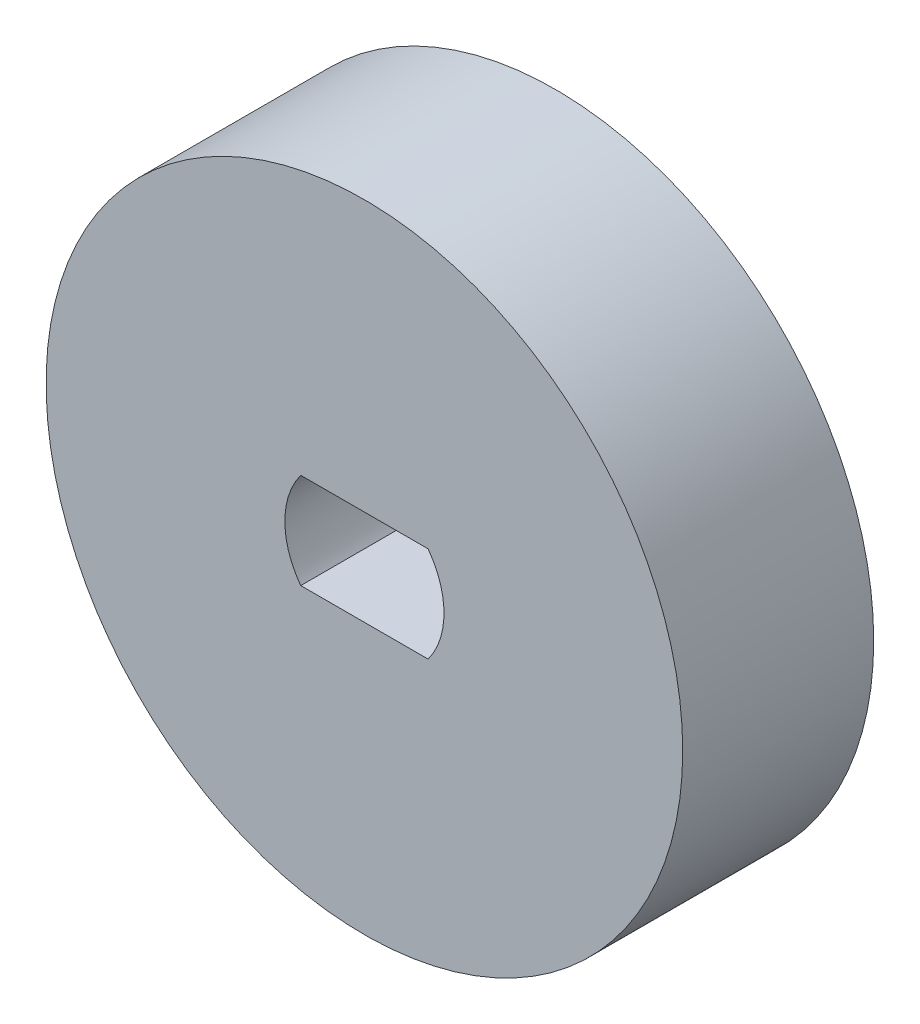
ISO-10303-21;
HEADER;
FILE_DESCRIPTION(('STEP AP214'),'2;1');
FILE_NAME('part.step','',(''),(''),'','','');
FILE_SCHEMA(('AUTOMOTIVE_DESIGN { 1 0 10303 214 1 1 1 1 }'));
ENDSEC;
DATA;
#1=APPLICATION_CONTEXT('core data for automotive mechanical design processes');
#2=APPLICATION_PROTOCOL_DEFINITION('international standard','automotive_design',2000,#1);
#3=PRODUCT_CONTEXT('',#1,'mechanical');
#4=PRODUCT('Part','Part','',(#3));
#5=PRODUCT_RELATED_PRODUCT_CATEGORY('part','',(#4));
#6=PRODUCT_DEFINITION_FORMATION('','',#4);
#7=PRODUCT_DEFINITION_CONTEXT('part definition',#1,'design');
#8=PRODUCT_DEFINITION('design','',#6,#7);
#9=PRODUCT_DEFINITION_SHAPE('','',#8);
#10=(LENGTH_UNIT() NAMED_UNIT(*) SI_UNIT(.MILLI.,.METRE.));
#11=(NAMED_UNIT(*) PLANE_ANGLE_UNIT() SI_UNIT($,.RADIAN.));
#12=(NAMED_UNIT(*) SI_UNIT($,.STERADIAN.) SOLID_ANGLE_UNIT());
#13=UNCERTAINTY_MEASURE_WITH_UNIT(LENGTH_MEASURE(1.E-05),#10,'distance_accuracy_value','');
#14=(GEOMETRIC_REPRESENTATION_CONTEXT(3) GLOBAL_UNCERTAINTY_ASSIGNED_CONTEXT((#13)) GLOBAL_UNIT_ASSIGNED_CONTEXT((#10,
#11,#12)) REPRESENTATION_CONTEXT('',''));
#15=CARTESIAN_POINT('',(0.,0.,0.));
#16=DIRECTION('',(0.,0.,1.));
#17=DIRECTION('',(1.,0.,0.));
#18=AXIS2_PLACEMENT_3D('',#15,#16,#17);
#19=CARTESIAN_POINT('',(8.50623475222368,0.,6.));
#20=DIRECTION('',(0.,0.,-1.));
#21=DIRECTION('',(-1.,0.,0.));
#22=AXIS2_PLACEMENT_3D('',#19,#20,#21);
#23=CYLINDRICAL_SURFACE('',#22,2.5);
#24=CARTESIAN_POINT('',(8.50623475222368,0.,0.));
#25=DIRECTION('',(0.,0.,1.));
#26=DIRECTION('',(1.,0.,0.));
#27=AXIS2_PLACEMENT_3D('',#24,#25,#26);
#28=CIRCLE('',#27,2.5);
#29=CARTESIAN_POINT('',(10.5062347522237,-1.5,0.));
#30=VERTEX_POINT('',#29);
#31=CARTESIAN_POINT('',(10.5062347522237,1.5,0.));
#32=VERTEX_POINT('',#31);
#33=EDGE_CURVE('E112',#30,#32,#28,.T.);
#34=ORIENTED_EDGE('',*,*,#33,.F.);
#35=DIRECTION('',(0.,0.,-1.));
#36=VECTOR('',#35,1.);
#37=CARTESIAN_POINT('',(10.5062347522237,-1.5,6.));
#38=LINE('',#37,#36);
#39=CARTESIAN_POINT('',(10.5062347522237,-1.5,6.));
#40=VERTEX_POINT('',#39);
#41=EDGE_CURVE('E11',#40,#30,#38,.T.);
#42=ORIENTED_EDGE('',*,*,#41,.F.);
#43=CARTESIAN_POINT('',(8.50623475222368,0.,6.));
#44=DIRECTION('',(0.,0.,1.));
#45=DIRECTION('',(1.,0.,0.));
#46=AXIS2_PLACEMENT_3D('',#43,#44,#45);
#47=CIRCLE('',#46,2.5);
#48=CARTESIAN_POINT('',(10.5062347522237,1.5,6.));
#49=VERTEX_POINT('',#48);
#50=EDGE_CURVE('E83',#40,#49,#47,.T.);
#51=ORIENTED_EDGE('',*,*,#50,.T.);
#52=DIRECTION('',(0.,0.,-1.));
#53=VECTOR('',#52,1.);
#54=CARTESIAN_POINT('',(10.5062347522237,1.5,6.));
#55=LINE('',#54,#53);
#56=EDGE_CURVE('E50',#49,#32,#55,.T.);
#57=ORIENTED_EDGE('',*,*,#56,.T.);
#58=EDGE_LOOP('',(#34,#42,#51,#57));
#59=FACE_BOUND('',#58,.T.);
#60=ADVANCED_FACE('F33',(#59),#23,.F.);
#61=CARTESIAN_POINT('',(0.,-1.5,6.));
#62=DIRECTION('',(0.,-1.,0.));
#63=DIRECTION('',(0.,0.,-1.));
#64=AXIS2_PLACEMENT_3D('',#61,#62,#63);
#65=PLANE('',#64);
#66=DIRECTION('',(-1.,0.,0.));
#67=VECTOR('',#66,1.);
#68=CARTESIAN_POINT('',(0.,-1.5,0.));
#69=LINE('',#68,#67);
#70=CARTESIAN_POINT('',(6.50623475222368,-1.5,0.));
#71=VERTEX_POINT('',#70);
#72=EDGE_CURVE('E88',#30,#71,#69,.T.);
#73=ORIENTED_EDGE('',*,*,#72,.T.);
#74=DIRECTION('',(0.,0.,-1.));
#75=VECTOR('',#74,1.);
#76=CARTESIAN_POINT('',(6.50623475222368,-1.5,6.));
#77=LINE('',#76,#75);
#78=CARTESIAN_POINT('',(6.50623475222368,-1.5,6.));
#79=VERTEX_POINT('',#78);
#80=EDGE_CURVE('E42',#79,#71,#77,.T.);
#81=ORIENTED_EDGE('',*,*,#80,.F.);
#82=DIRECTION('',(-1.,0.,0.));
#83=VECTOR('',#82,1.);
#84=CARTESIAN_POINT('',(0.,-1.5,6.));
#85=LINE('',#84,#83);
#86=EDGE_CURVE('E76',#40,#79,#85,.T.);
#87=ORIENTED_EDGE('',*,*,#86,.F.);
#88=ORIENTED_EDGE('',*,*,#41,.T.);
#89=EDGE_LOOP('',(#73,#81,#87,#88));
#90=FACE_BOUND('',#89,.T.);
#91=ADVANCED_FACE('F35',(#90),#65,.F.);
#92=CARTESIAN_POINT('',(6.50623475222368,1.5,0.));
#93=VERTEX_POINT('',#92);
#94=EDGE_CURVE('E103',#93,#71,#28,.T.);
#95=ORIENTED_EDGE('',*,*,#94,.F.);
#96=DIRECTION('',(0.,0.,-1.));
#97=VECTOR('',#96,1.);
#98=CARTESIAN_POINT('',(6.50623475222368,1.5,6.));
#99=LINE('',#98,#97);
#100=CARTESIAN_POINT('',(6.50623475222368,1.5,6.));
#101=VERTEX_POINT('',#100);
#102=EDGE_CURVE('E63',#101,#93,#99,.T.);
#103=ORIENTED_EDGE('',*,*,#102,.F.);
#104=EDGE_CURVE('E82',#101,#79,#47,.T.);
#105=ORIENTED_EDGE('',*,*,#104,.T.);
#106=ORIENTED_EDGE('',*,*,#80,.T.);
#107=EDGE_LOOP('',(#95,#103,#105,#106));
#108=FACE_BOUND('',#107,.T.);
#109=ADVANCED_FACE('F91',(#108),#23,.F.);
#110=CARTESIAN_POINT('',(0.,1.5,6.));
#111=DIRECTION('',(0.,-1.,0.));
#112=DIRECTION('',(0.,0.,-1.));
#113=AXIS2_PLACEMENT_3D('',#110,#111,#112);
#114=PLANE('',#113);
#115=DIRECTION('',(-1.,0.,0.));
#116=VECTOR('',#115,1.);
#117=CARTESIAN_POINT('',(0.,1.5,0.));
#118=LINE('',#117,#116);
#119=EDGE_CURVE('E98',#32,#93,#118,.T.);
#120=ORIENTED_EDGE('',*,*,#119,.F.);
#121=ORIENTED_EDGE('',*,*,#56,.F.);
#122=DIRECTION('',(-1.,0.,0.));
#123=VECTOR('',#122,1.);
#124=CARTESIAN_POINT('',(0.,1.5,6.));
#125=LINE('',#124,#123);
#126=EDGE_CURVE('E92',#49,#101,#125,.T.);
#127=ORIENTED_EDGE('',*,*,#126,.T.);
#128=ORIENTED_EDGE('',*,*,#102,.T.);
#129=EDGE_LOOP('',(#120,#121,#127,#128));
#130=FACE_BOUND('',#129,.T.);
#131=ADVANCED_FACE('F116',(#130),#114,.T.);
#132=CARTESIAN_POINT('',(8.50623475222368,0.,6.));
#133=DIRECTION('',(0.,0.,-1.));
#134=DIRECTION('',(-1.,0.,0.));
#135=AXIS2_PLACEMENT_3D('',#132,#133,#134);
#136=CYLINDRICAL_SURFACE('',#135,10.);
#137=CARTESIAN_POINT('',(8.50623475222368,0.,6.));
#138=DIRECTION('',(0.,0.,1.));
#139=DIRECTION('',(1.,0.,0.));
#140=AXIS2_PLACEMENT_3D('',#137,#138,#139);
#141=CIRCLE('',#140,10.);
#142=CARTESIAN_POINT('',(18.5062347522237,0.,6.));
#143=VERTEX_POINT('',#142);
#144=EDGE_CURVE('E94',#143,#143,#141,.T.);
#145=ORIENTED_EDGE('',*,*,#144,.F.);
#146=EDGE_LOOP('',(#145));
#147=FACE_BOUND('',#146,.T.);
#148=CARTESIAN_POINT('',(8.50623475222368,0.,0.));
#149=DIRECTION('',(0.,0.,1.));
#150=DIRECTION('',(1.,0.,0.));
#151=AXIS2_PLACEMENT_3D('',#148,#149,#150);
#152=CIRCLE('',#151,10.);
#153=CARTESIAN_POINT('',(18.5062347522237,0.,0.));
#154=VERTEX_POINT('',#153);
#155=EDGE_CURVE('E96',#154,#154,#152,.T.);
#156=ORIENTED_EDGE('',*,*,#155,.T.);
#157=EDGE_LOOP('',(#156));
#158=FACE_BOUND('',#157,.T.);
#159=ADVANCED_FACE('F118',(#147,#158),#136,.T.);
#160=CARTESIAN_POINT('',(0.,0.,6.));
#161=DIRECTION('',(0.,0.,1.));
#162=DIRECTION('',(1.,0.,0.));
#163=AXIS2_PLACEMENT_3D('',#160,#161,#162);
#164=PLANE('',#163);
#165=ORIENTED_EDGE('',*,*,#50,.F.);
#166=ORIENTED_EDGE('',*,*,#86,.T.);
#167=ORIENTED_EDGE('',*,*,#104,.F.);
#168=ORIENTED_EDGE('',*,*,#126,.F.);
#169=EDGE_LOOP('',(#165,#166,#167,#168));
#170=FACE_BOUND('',#169,.T.);
#171=ORIENTED_EDGE('',*,*,#144,.T.);
#172=EDGE_LOOP('',(#171));
#173=FACE_BOUND('',#172,.T.);
#174=ADVANCED_FACE('F78',(#170,#173),#164,.T.);
#175=CARTESIAN_POINT('',(0.,0.,0.));
#176=DIRECTION('',(0.,0.,1.));
#177=DIRECTION('',(1.,0.,0.));
#178=AXIS2_PLACEMENT_3D('',#175,#176,#177);
#179=PLANE('',#178);
#180=ORIENTED_EDGE('',*,*,#33,.T.);
#181=ORIENTED_EDGE('',*,*,#119,.T.);
#182=ORIENTED_EDGE('',*,*,#94,.T.);
#183=ORIENTED_EDGE('',*,*,#72,.F.);
#184=EDGE_LOOP('',(#180,#181,#182,#183));
#185=FACE_BOUND('',#184,.T.);
#186=ORIENTED_EDGE('',*,*,#155,.F.);
#187=EDGE_LOOP('',(#186));
#188=FACE_BOUND('',#187,.T.);
#189=ADVANCED_FACE('F114',(#185,#188),#179,.F.);
#190=CLOSED_SHELL('',(#60,#91,#109,#131,#159,#174,#189));
#191=MANIFOLD_SOLID_BREP('B2',#190);
#192=ADVANCED_BREP_SHAPE_REPRESENTATION('',(#18,#191),#14);
#193=SHAPE_DEFINITION_REPRESENTATION(#9,#192);
ENDSEC;
END-ISO-10303-21;
